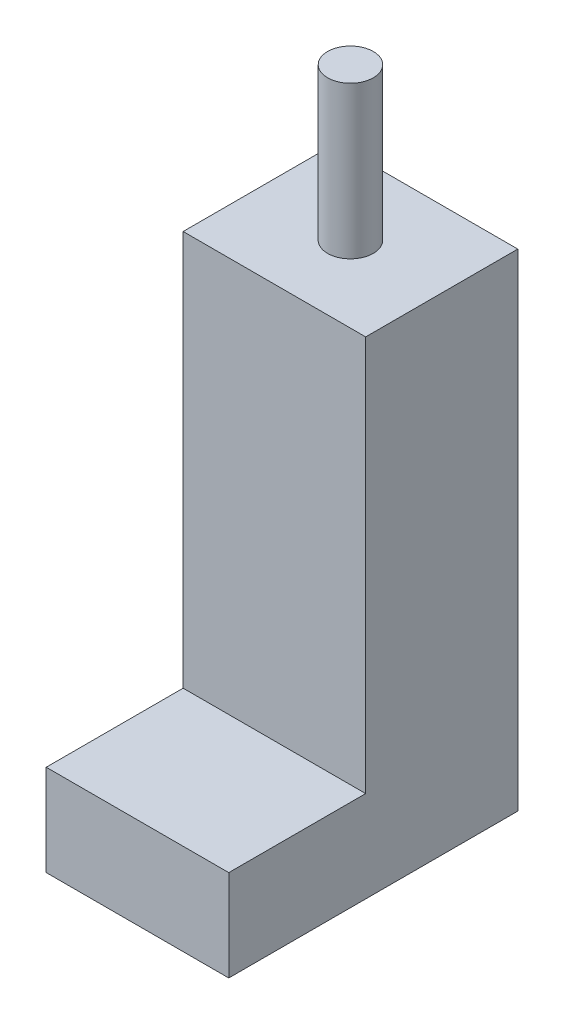
ISO-10303-21;
HEADER;
FILE_DESCRIPTION(('STEP AP214'),'2;1');
FILE_NAME('part.step','',(''),(''),'','','');
FILE_SCHEMA(('AUTOMOTIVE_DESIGN { 1 0 10303 214 1 1 1 1 }'));
ENDSEC;
DATA;
#1=APPLICATION_CONTEXT('core data for automotive mechanical design processes');
#2=APPLICATION_PROTOCOL_DEFINITION('international standard','automotive_design',2000,#1);
#3=PRODUCT_CONTEXT('',#1,'mechanical');
#4=PRODUCT('Part','Part','',(#3));
#5=PRODUCT_RELATED_PRODUCT_CATEGORY('part','',(#4));
#6=PRODUCT_DEFINITION_FORMATION('','',#4);
#7=PRODUCT_DEFINITION_CONTEXT('part definition',#1,'design');
#8=PRODUCT_DEFINITION('design','',#6,#7);
#9=PRODUCT_DEFINITION_SHAPE('','',#8);
#10=(LENGTH_UNIT() NAMED_UNIT(*) SI_UNIT(.MILLI.,.METRE.));
#11=(NAMED_UNIT(*) PLANE_ANGLE_UNIT() SI_UNIT($,.RADIAN.));
#12=(NAMED_UNIT(*) SI_UNIT($,.STERADIAN.) SOLID_ANGLE_UNIT());
#13=UNCERTAINTY_MEASURE_WITH_UNIT(LENGTH_MEASURE(1.E-05),#10,'distance_accuracy_value','');
#14=(GEOMETRIC_REPRESENTATION_CONTEXT(3) GLOBAL_UNCERTAINTY_ASSIGNED_CONTEXT((#13)) GLOBAL_UNIT_ASSIGNED_CONTEXT((#10,
#11,#12)) REPRESENTATION_CONTEXT('',''));
#15=CARTESIAN_POINT('',(0.,0.,0.));
#16=DIRECTION('',(0.,0.,1.));
#17=DIRECTION('',(1.,0.,0.));
#18=AXIS2_PLACEMENT_3D('',#15,#16,#17);
#19=CARTESIAN_POINT('',(-6.,32.,5.));
#20=DIRECTION('',(0.,0.,-1.));
#21=DIRECTION('',(-1.,0.,0.));
#22=AXIS2_PLACEMENT_3D('',#19,#20,#21);
#23=PLANE('',#22);
#24=DIRECTION('',(-1.,0.,0.));
#25=VECTOR('',#24,1.);
#26=CARTESIAN_POINT('',(-6.,6.,5.));
#27=LINE('',#26,#25);
#28=CARTESIAN_POINT('',(6.,6.,5.));
#29=VERTEX_POINT('',#28);
#30=CARTESIAN_POINT('',(-6.,6.,5.));
#31=VERTEX_POINT('',#30);
#32=EDGE_CURVE('E50',#29,#31,#27,.T.);
#33=ORIENTED_EDGE('',*,*,#32,.F.);
#34=DIRECTION('',(0.,-1.,0.));
#35=VECTOR('',#34,1.);
#36=CARTESIAN_POINT('',(6.,32.,5.));
#37=LINE('',#36,#35);
#38=CARTESIAN_POINT('',(6.,32.,5.));
#39=VERTEX_POINT('',#38);
#40=EDGE_CURVE('E140',#39,#29,#37,.T.);
#41=ORIENTED_EDGE('',*,*,#40,.F.);
#42=DIRECTION('',(1.,0.,0.));
#43=VECTOR('',#42,1.);
#44=CARTESIAN_POINT('',(-6.,32.,5.));
#45=LINE('',#44,#43);
#46=CARTESIAN_POINT('',(-6.,32.,5.));
#47=VERTEX_POINT('',#46);
#48=EDGE_CURVE('E132',#47,#39,#45,.T.);
#49=ORIENTED_EDGE('',*,*,#48,.F.);
#50=DIRECTION('',(0.,-1.,0.));
#51=VECTOR('',#50,1.);
#52=CARTESIAN_POINT('',(-6.,32.,5.));
#53=LINE('',#52,#51);
#54=EDGE_CURVE('E139',#47,#31,#53,.T.);
#55=ORIENTED_EDGE('',*,*,#54,.T.);
#56=EDGE_LOOP('',(#33,#41,#49,#55));
#57=FACE_BOUND('',#56,.T.);
#58=ADVANCED_FACE('F33',(#57),#23,.F.);
#59=CARTESIAN_POINT('',(-6.,32.,-5.));
#60=DIRECTION('',(0.,0.,-1.));
#61=DIRECTION('',(-1.,0.,0.));
#62=AXIS2_PLACEMENT_3D('',#59,#60,#61);
#63=PLANE('',#62);
#64=DIRECTION('',(1.,0.,0.));
#65=VECTOR('',#64,1.);
#66=CARTESIAN_POINT('',(-6.,0.,-5.));
#67=LINE('',#66,#65);
#68=CARTESIAN_POINT('',(-6.,0.,-5.));
#69=VERTEX_POINT('',#68);
#70=CARTESIAN_POINT('',(6.,0.,-5.));
#71=VERTEX_POINT('',#70);
#72=EDGE_CURVE('E127',#69,#71,#67,.T.);
#73=ORIENTED_EDGE('',*,*,#72,.F.);
#74=DIRECTION('',(0.,-1.,0.));
#75=VECTOR('',#74,1.);
#76=CARTESIAN_POINT('',(-6.,32.,-5.));
#77=LINE('',#76,#75);
#78=CARTESIAN_POINT('',(-6.,32.,-5.));
#79=VERTEX_POINT('',#78);
#80=EDGE_CURVE('E42',#79,#69,#77,.T.);
#81=ORIENTED_EDGE('',*,*,#80,.F.);
#82=DIRECTION('',(1.,0.,0.));
#83=VECTOR('',#82,1.);
#84=CARTESIAN_POINT('',(-6.,32.,-5.));
#85=LINE('',#84,#83);
#86=CARTESIAN_POINT('',(6.,32.,-5.));
#87=VERTEX_POINT('',#86);
#88=EDGE_CURVE('E101',#79,#87,#85,.T.);
#89=ORIENTED_EDGE('',*,*,#88,.T.);
#90=DIRECTION('',(0.,-1.,0.));
#91=VECTOR('',#90,1.);
#92=CARTESIAN_POINT('',(6.,32.,-5.));
#93=LINE('',#92,#91);
#94=EDGE_CURVE('E37',#87,#71,#93,.T.);
#95=ORIENTED_EDGE('',*,*,#94,.T.);
#96=EDGE_LOOP('',(#73,#81,#89,#95));
#97=FACE_BOUND('',#96,.T.);
#98=ADVANCED_FACE('F35',(#97),#63,.T.);
#99=CARTESIAN_POINT('',(-6.,32.,-5.));
#100=DIRECTION('',(1.,0.,0.));
#101=DIRECTION('',(0.,0.,-1.));
#102=AXIS2_PLACEMENT_3D('',#99,#100,#101);
#103=PLANE('',#102);
#104=DIRECTION('',(0.,0.,1.));
#105=VECTOR('',#104,1.);
#106=CARTESIAN_POINT('',(-6.,0.,-5.));
#107=LINE('',#106,#105);
#108=CARTESIAN_POINT('',(-6.,0.,14.));
#109=VERTEX_POINT('',#108);
#110=EDGE_CURVE('E93',#69,#109,#107,.T.);
#111=ORIENTED_EDGE('',*,*,#110,.T.);
#112=DIRECTION('',(0.,-1.,0.));
#113=VECTOR('',#112,1.);
#114=CARTESIAN_POINT('',(-6.,0.,14.));
#115=LINE('',#114,#113);
#116=CARTESIAN_POINT('',(-6.,6.,14.));
#117=VERTEX_POINT('',#116);
#118=EDGE_CURVE('E98',#117,#109,#115,.T.);
#119=ORIENTED_EDGE('',*,*,#118,.F.);
#120=DIRECTION('',(0.,0.,-1.));
#121=VECTOR('',#120,1.);
#122=CARTESIAN_POINT('',(-6.,6.,14.));
#123=LINE('',#122,#121);
#124=EDGE_CURVE('E119',#117,#31,#123,.T.);
#125=ORIENTED_EDGE('',*,*,#124,.T.);
#126=ORIENTED_EDGE('',*,*,#54,.F.);
#127=DIRECTION('',(0.,0.,1.));
#128=VECTOR('',#127,1.);
#129=CARTESIAN_POINT('',(-6.,32.,-5.));
#130=LINE('',#129,#128);
#131=EDGE_CURVE('E134',#79,#47,#130,.T.);
#132=ORIENTED_EDGE('',*,*,#131,.F.);
#133=ORIENTED_EDGE('',*,*,#80,.T.);
#134=EDGE_LOOP('',(#111,#119,#125,#126,#132,#133));
#135=FACE_BOUND('',#134,.T.);
#136=ADVANCED_FACE('F95',(#135),#103,.F.);
#137=CARTESIAN_POINT('',(6.,32.,-5.));
#138=DIRECTION('',(1.,0.,0.));
#139=DIRECTION('',(0.,0.,-1.));
#140=AXIS2_PLACEMENT_3D('',#137,#138,#139);
#141=PLANE('',#140);
#142=DIRECTION('',(0.,0.,1.));
#143=VECTOR('',#142,1.);
#144=CARTESIAN_POINT('',(6.,0.,-5.));
#145=LINE('',#144,#143);
#146=CARTESIAN_POINT('',(6.,0.,14.));
#147=VERTEX_POINT('',#146);
#148=EDGE_CURVE('E102',#71,#147,#145,.T.);
#149=ORIENTED_EDGE('',*,*,#148,.F.);
#150=ORIENTED_EDGE('',*,*,#94,.F.);
#151=DIRECTION('',(0.,0.,1.));
#152=VECTOR('',#151,1.);
#153=CARTESIAN_POINT('',(6.,32.,-5.));
#154=LINE('',#153,#152);
#155=EDGE_CURVE('E130',#87,#39,#154,.T.);
#156=ORIENTED_EDGE('',*,*,#155,.T.);
#157=ORIENTED_EDGE('',*,*,#40,.T.);
#158=DIRECTION('',(0.,0.,-1.));
#159=VECTOR('',#158,1.);
#160=CARTESIAN_POINT('',(6.,6.,14.));
#161=LINE('',#160,#159);
#162=CARTESIAN_POINT('',(6.,6.,14.));
#163=VERTEX_POINT('',#162);
#164=EDGE_CURVE('E122',#163,#29,#161,.T.);
#165=ORIENTED_EDGE('',*,*,#164,.F.);
#166=DIRECTION('',(0.,1.,0.));
#167=VECTOR('',#166,1.);
#168=CARTESIAN_POINT('',(6.,0.,14.));
#169=LINE('',#168,#167);
#170=EDGE_CURVE('E109',#147,#163,#169,.T.);
#171=ORIENTED_EDGE('',*,*,#170,.F.);
#172=EDGE_LOOP('',(#149,#150,#156,#157,#165,#171));
#173=FACE_BOUND('',#172,.T.);
#174=ADVANCED_FACE('F143',(#173),#141,.T.);
#175=CARTESIAN_POINT('',(0.,32.,0.));
#176=DIRECTION('',(0.,-1.,0.));
#177=DIRECTION('',(0.,0.,-1.));
#178=AXIS2_PLACEMENT_3D('',#175,#176,#177);
#179=PLANE('',#178);
#180=CARTESIAN_POINT('',(0.,32.,0.));
#181=DIRECTION('',(0.,1.,0.));
#182=DIRECTION('',(0.,0.,1.));
#183=AXIS2_PLACEMENT_3D('',#180,#181,#182);
#184=CIRCLE('',#183,1.5);
#185=CARTESIAN_POINT('',(0.,32.,1.5));
#186=VERTEX_POINT('',#185);
#187=EDGE_CURVE('E11',#186,#186,#184,.T.);
#188=ORIENTED_EDGE('',*,*,#187,.F.);
#189=EDGE_LOOP('',(#188));
#190=FACE_BOUND('',#189,.T.);
#191=ORIENTED_EDGE('',*,*,#88,.F.);
#192=ORIENTED_EDGE('',*,*,#131,.T.);
#193=ORIENTED_EDGE('',*,*,#48,.T.);
#194=ORIENTED_EDGE('',*,*,#155,.F.);
#195=EDGE_LOOP('',(#191,#192,#193,#194));
#196=FACE_BOUND('',#195,.T.);
#197=ADVANCED_FACE('F149',(#190,#196),#179,.F.);
#198=CARTESIAN_POINT('',(0.,0.,0.));
#199=DIRECTION('',(0.,-1.,0.));
#200=DIRECTION('',(0.,0.,-1.));
#201=AXIS2_PLACEMENT_3D('',#198,#199,#200);
#202=PLANE('',#201);
#203=ORIENTED_EDGE('',*,*,#72,.T.);
#204=ORIENTED_EDGE('',*,*,#148,.T.);
#205=DIRECTION('',(1.,0.,0.));
#206=VECTOR('',#205,1.);
#207=CARTESIAN_POINT('',(-6.,0.,14.));
#208=LINE('',#207,#206);
#209=EDGE_CURVE('E105',#109,#147,#208,.T.);
#210=ORIENTED_EDGE('',*,*,#209,.F.);
#211=ORIENTED_EDGE('',*,*,#110,.F.);
#212=EDGE_LOOP('',(#203,#204,#210,#211));
#213=FACE_BOUND('',#212,.T.);
#214=ADVANCED_FACE('F106',(#213),#202,.T.);
#215=CARTESIAN_POINT('',(0.,42.,0.));
#216=DIRECTION('',(0.,-1.,0.));
#217=DIRECTION('',(0.,0.,-1.));
#218=AXIS2_PLACEMENT_3D('',#215,#216,#217);
#219=CYLINDRICAL_SURFACE('',#218,1.5);
#220=CARTESIAN_POINT('',(0.,42.,0.));
#221=DIRECTION('',(0.,1.,0.));
#222=DIRECTION('',(0.,0.,1.));
#223=AXIS2_PLACEMENT_3D('',#220,#221,#222);
#224=CIRCLE('',#223,1.5);
#225=CARTESIAN_POINT('',(0.,42.,1.5));
#226=VERTEX_POINT('',#225);
#227=EDGE_CURVE('E125',#226,#226,#224,.T.);
#228=ORIENTED_EDGE('',*,*,#227,.F.);
#229=EDGE_LOOP('',(#228));
#230=FACE_BOUND('',#229,.T.);
#231=ORIENTED_EDGE('',*,*,#187,.T.);
#232=EDGE_LOOP('',(#231));
#233=FACE_BOUND('',#232,.T.);
#234=ADVANCED_FACE('F157',(#230,#233),#219,.T.);
#235=CARTESIAN_POINT('',(0.,42.,0.));
#236=DIRECTION('',(0.,1.,0.));
#237=DIRECTION('',(0.,0.,1.));
#238=AXIS2_PLACEMENT_3D('',#235,#236,#237);
#239=PLANE('',#238);
#240=ORIENTED_EDGE('',*,*,#227,.T.);
#241=EDGE_LOOP('',(#240));
#242=FACE_BOUND('',#241,.T.);
#243=ADVANCED_FACE('F194',(#242),#239,.T.);
#244=CARTESIAN_POINT('',(-6.,6.,14.));
#245=DIRECTION('',(0.,-1.,0.));
#246=DIRECTION('',(0.,0.,-1.));
#247=AXIS2_PLACEMENT_3D('',#244,#245,#246);
#248=PLANE('',#247);
#249=ORIENTED_EDGE('',*,*,#32,.T.);
#250=ORIENTED_EDGE('',*,*,#124,.F.);
#251=DIRECTION('',(-1.,0.,0.));
#252=VECTOR('',#251,1.);
#253=CARTESIAN_POINT('',(-6.,6.,14.));
#254=LINE('',#253,#252);
#255=EDGE_CURVE('E113',#163,#117,#254,.T.);
#256=ORIENTED_EDGE('',*,*,#255,.F.);
#257=ORIENTED_EDGE('',*,*,#164,.T.);
#258=EDGE_LOOP('',(#249,#250,#256,#257));
#259=FACE_BOUND('',#258,.T.);
#260=ADVANCED_FACE('F145',(#259),#248,.F.);
#261=CARTESIAN_POINT('',(0.,0.,14.));
#262=DIRECTION('',(0.,0.,-1.));
#263=DIRECTION('',(-1.,0.,0.));
#264=AXIS2_PLACEMENT_3D('',#261,#262,#263);
#265=PLANE('',#264);
#266=ORIENTED_EDGE('',*,*,#118,.T.);
#267=ORIENTED_EDGE('',*,*,#209,.T.);
#268=ORIENTED_EDGE('',*,*,#170,.T.);
#269=ORIENTED_EDGE('',*,*,#255,.T.);
#270=EDGE_LOOP('',(#266,#267,#268,#269));
#271=FACE_BOUND('',#270,.T.);
#272=ADVANCED_FACE('F111',(#271),#265,.F.);
#273=CLOSED_SHELL('',(#58,#98,#136,#174,#197,#214,#234,#243,#260,#272));
#274=MANIFOLD_SOLID_BREP('B2',#273);
#275=ADVANCED_BREP_SHAPE_REPRESENTATION('',(#18,#274),#14);
#276=SHAPE_DEFINITION_REPRESENTATION(#9,#275);
ENDSEC;
END-ISO-10303-21;
